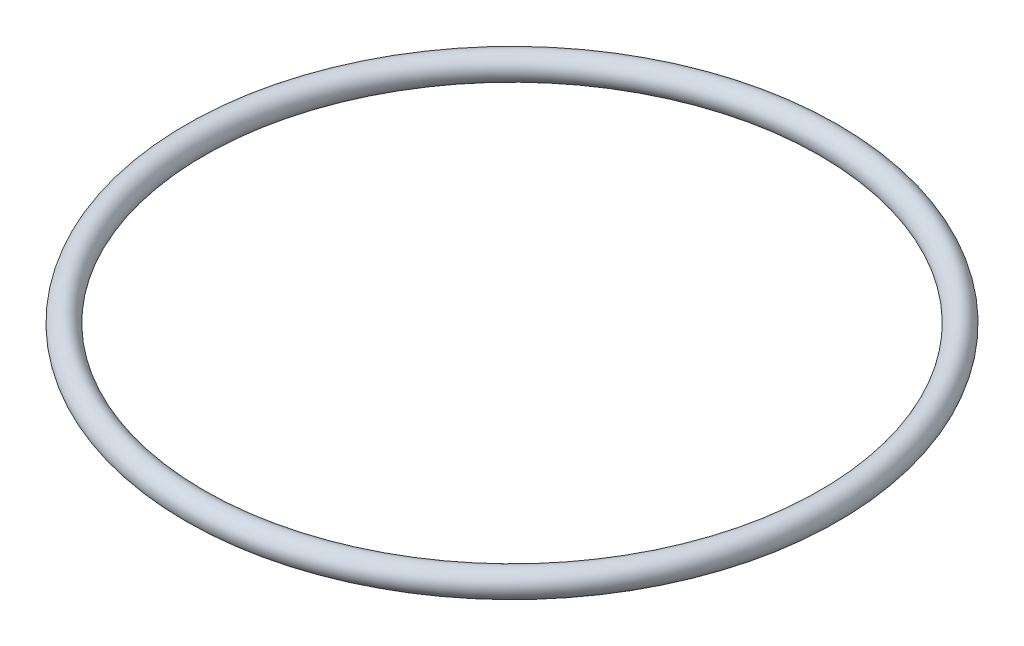
ISO-10303-21;
HEADER;
FILE_DESCRIPTION(('STEP AP214'),'2;1');
FILE_NAME('part.step','',(''),(''),'','','');
FILE_SCHEMA(('AUTOMOTIVE_DESIGN { 1 0 10303 214 1 1 1 1 }'));
ENDSEC;
DATA;
#1=APPLICATION_CONTEXT('core data for automotive mechanical design processes');
#2=APPLICATION_PROTOCOL_DEFINITION('international standard','automotive_design',2000,#1);
#3=PRODUCT_CONTEXT('',#1,'mechanical');
#4=PRODUCT('Part','Part','',(#3));
#5=PRODUCT_RELATED_PRODUCT_CATEGORY('part','',(#4));
#6=PRODUCT_DEFINITION_FORMATION('','',#4);
#7=PRODUCT_DEFINITION_CONTEXT('part definition',#1,'design');
#8=PRODUCT_DEFINITION('design','',#6,#7);
#9=PRODUCT_DEFINITION_SHAPE('','',#8);
#10=(LENGTH_UNIT() NAMED_UNIT(*) SI_UNIT(.MILLI.,.METRE.));
#11=(NAMED_UNIT(*) PLANE_ANGLE_UNIT() SI_UNIT($,.RADIAN.));
#12=(NAMED_UNIT(*) SI_UNIT($,.STERADIAN.) SOLID_ANGLE_UNIT());
#13=UNCERTAINTY_MEASURE_WITH_UNIT(LENGTH_MEASURE(1.E-05),#10,'distance_accuracy_value','');
#14=(GEOMETRIC_REPRESENTATION_CONTEXT(3) GLOBAL_UNCERTAINTY_ASSIGNED_CONTEXT((#13)) GLOBAL_UNIT_ASSIGNED_CONTEXT((#10,
#11,#12)) REPRESENTATION_CONTEXT('',''));
#15=CARTESIAN_POINT('',(0.,0.,0.));
#16=DIRECTION('',(0.,0.,1.));
#17=DIRECTION('',(1.,0.,0.));
#18=AXIS2_PLACEMENT_3D('',#15,#16,#17);
#19=CARTESIAN_POINT('',(0.,0.,0.));
#20=DIRECTION('',(0.,-1.,0.));
#21=DIRECTION('',(0.,0.,-1.));
#22=AXIS2_PLACEMENT_3D('',#19,#20,#21);
#23=TOROIDAL_SURFACE('',#22,19.84375,0.793749999999999);
#24=CARTESIAN_POINT('',(0.,0.,-20.6375));
#25=VERTEX_POINT('',#24);
#26=VERTEX_LOOP('',#25);
#27=FACE_BOUND('',#26,.T.);
#28=ADVANCED_FACE('F30',(#27),#23,.T.);
#29=CLOSED_SHELL('',(#28));
#30=MANIFOLD_SOLID_BREP('B2',#29);
#31=ADVANCED_BREP_SHAPE_REPRESENTATION('',(#18,#30),#14);
#32=SHAPE_DEFINITION_REPRESENTATION(#9,#31);
ENDSEC;
END-ISO-10303-21;
